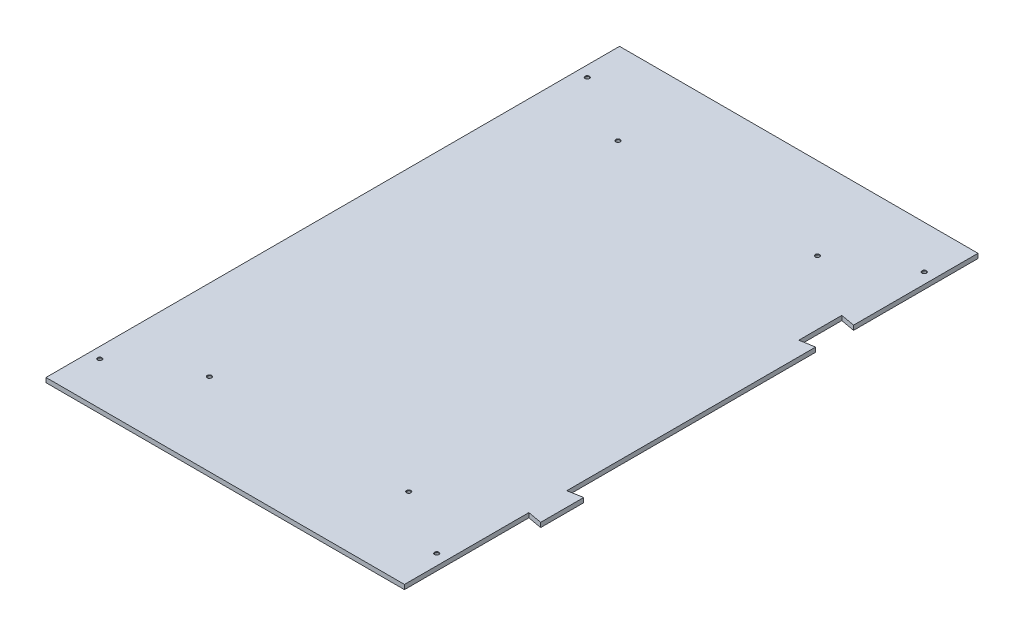
ISO-10303-21;
HEADER;
FILE_DESCRIPTION(('STEP AP214'),'2;1');
FILE_NAME('part.step','',(''),(''),'','','');
FILE_SCHEMA(('AUTOMOTIVE_DESIGN { 1 0 10303 214 1 1 1 1 }'));
ENDSEC;
DATA;
#1=APPLICATION_CONTEXT('core data for automotive mechanical design processes');
#2=APPLICATION_PROTOCOL_DEFINITION('international standard','automotive_design',2000,#1);
#3=PRODUCT_CONTEXT('',#1,'mechanical');
#4=PRODUCT('Part','Part','',(#3));
#5=PRODUCT_RELATED_PRODUCT_CATEGORY('part','',(#4));
#6=PRODUCT_DEFINITION_FORMATION('','',#4);
#7=PRODUCT_DEFINITION_CONTEXT('part definition',#1,'design');
#8=PRODUCT_DEFINITION('design','',#6,#7);
#9=PRODUCT_DEFINITION_SHAPE('','',#8);
#10=(LENGTH_UNIT() NAMED_UNIT(*) SI_UNIT(.MILLI.,.METRE.));
#11=(NAMED_UNIT(*) PLANE_ANGLE_UNIT() SI_UNIT($,.RADIAN.));
#12=(NAMED_UNIT(*) SI_UNIT($,.STERADIAN.) SOLID_ANGLE_UNIT());
#13=UNCERTAINTY_MEASURE_WITH_UNIT(LENGTH_MEASURE(1.E-05),#10,'distance_accuracy_value','');
#14=(GEOMETRIC_REPRESENTATION_CONTEXT(3) GLOBAL_UNCERTAINTY_ASSIGNED_CONTEXT((#13)) GLOBAL_UNIT_ASSIGNED_CONTEXT((#10,
#11,#12)) REPRESENTATION_CONTEXT('',''));
#15=CARTESIAN_POINT('',(0.,0.,0.));
#16=DIRECTION('',(0.,0.,1.));
#17=DIRECTION('',(1.,0.,0.));
#18=AXIS2_PLACEMENT_3D('',#15,#16,#17);
#19=CARTESIAN_POINT('',(0.,3.175,86.7632698070847));
#20=DIRECTION('',(-1.,0.,0.));
#21=DIRECTION('',(0.,0.,1.));
#22=AXIS2_PLACEMENT_3D('',#19,#20,#21);
#23=PLANE('',#22);
#24=DIRECTION('',(0.,0.,-1.));
#25=VECTOR('',#24,1.);
#26=CARTESIAN_POINT('',(0.,0.,86.7632698070847));
#27=LINE('',#26,#25);
#28=CARTESIAN_POINT('',(0.,0.,86.7632698070847));
#29=VERTEX_POINT('',#28);
#30=CARTESIAN_POINT('',(0.,0.,-86.7632698070847));
#31=VERTEX_POINT('',#30);
#32=EDGE_CURVE('E153',#29,#31,#27,.T.);
#33=ORIENTED_EDGE('',*,*,#32,.T.);
#34=DIRECTION('',(0.,-1.,0.));
#35=VECTOR('',#34,1.);
#36=CARTESIAN_POINT('',(0.,3.175,-86.7632698070847));
#37=LINE('',#36,#35);
#38=CARTESIAN_POINT('',(0.,3.175,-86.7632698070847));
#39=VERTEX_POINT('',#38);
#40=EDGE_CURVE('E11',#39,#31,#37,.T.);
#41=ORIENTED_EDGE('',*,*,#40,.F.);
#42=DIRECTION('',(0.,0.,-1.));
#43=VECTOR('',#42,1.);
#44=CARTESIAN_POINT('',(0.,3.175,86.7632698070847));
#45=LINE('',#44,#43);
#46=CARTESIAN_POINT('',(0.,3.175,86.7632698070847));
#47=VERTEX_POINT('',#46);
#48=EDGE_CURVE('E176',#47,#39,#45,.T.);
#49=ORIENTED_EDGE('',*,*,#48,.F.);
#50=DIRECTION('',(0.,-1.,0.));
#51=VECTOR('',#50,1.);
#52=CARTESIAN_POINT('',(0.,3.175,86.7632698070847));
#53=LINE('',#52,#51);
#54=EDGE_CURVE('E149',#47,#29,#53,.T.);
#55=ORIENTED_EDGE('',*,*,#54,.T.);
#56=EDGE_LOOP('',(#33,#41,#49,#55));
#57=FACE_BOUND('',#56,.T.);
#58=ADVANCED_FACE('F33',(#57),#23,.F.);
#59=CARTESIAN_POINT('',(0.,3.175,-86.7632698070847));
#60=DIRECTION('',(0.173648177666935,0.,0.984807753012207));
#61=DIRECTION('',(0.984807753012207,0.,-0.173648177666935));
#62=AXIS2_PLACEMENT_3D('',#59,#60,#61);
#63=PLANE('',#62);
#64=DIRECTION('',(-0.984807753012207,0.,0.173648177666935));
#65=VECTOR('',#64,1.);
#66=CARTESIAN_POINT('',(0.,0.,-86.7632698070847));
#67=LINE('',#66,#65);
#68=CARTESIAN_POINT('',(-10.,0.,-85.));
#69=VERTEX_POINT('',#68);
#70=EDGE_CURVE('E156',#31,#69,#67,.T.);
#71=ORIENTED_EDGE('',*,*,#70,.T.);
#72=DIRECTION('',(0.,-1.,0.));
#73=VECTOR('',#72,1.);
#74=CARTESIAN_POINT('',(-10.,3.175,-85.));
#75=LINE('',#74,#73);
#76=CARTESIAN_POINT('',(-10.,3.175,-85.));
#77=VERTEX_POINT('',#76);
#78=EDGE_CURVE('E41',#77,#69,#75,.T.);
#79=ORIENTED_EDGE('',*,*,#78,.F.);
#80=DIRECTION('',(-0.984807753012207,0.,0.173648177666935));
#81=VECTOR('',#80,1.);
#82=CARTESIAN_POINT('',(0.,3.175,-86.7632698070847));
#83=LINE('',#82,#81);
#84=EDGE_CURVE('E104',#39,#77,#83,.T.);
#85=ORIENTED_EDGE('',*,*,#84,.F.);
#86=ORIENTED_EDGE('',*,*,#40,.T.);
#87=EDGE_LOOP('',(#71,#79,#85,#86));
#88=FACE_BOUND('',#87,.T.);
#89=ADVANCED_FACE('F255',(#88),#63,.F.);
#90=CARTESIAN_POINT('',(-10.,3.175,-85.));
#91=DIRECTION('',(-1.,0.,0.));
#92=DIRECTION('',(0.,0.,1.));
#93=AXIS2_PLACEMENT_3D('',#90,#91,#92);
#94=PLANE('',#93);
#95=DIRECTION('',(0.,0.,-1.));
#96=VECTOR('',#95,1.);
#97=CARTESIAN_POINT('',(-10.,0.,-85.));
#98=LINE('',#97,#96);
#99=CARTESIAN_POINT('',(-10.,0.,-115.));
#100=VERTEX_POINT('',#99);
#101=EDGE_CURVE('E159',#69,#100,#98,.T.);
#102=ORIENTED_EDGE('',*,*,#101,.T.);
#103=DIRECTION('',(0.,-1.,0.));
#104=VECTOR('',#103,1.);
#105=CARTESIAN_POINT('',(-10.,3.175,-115.));
#106=LINE('',#105,#104);
#107=CARTESIAN_POINT('',(-10.,3.175,-115.));
#108=VERTEX_POINT('',#107);
#109=EDGE_CURVE('E195',#108,#100,#106,.T.);
#110=ORIENTED_EDGE('',*,*,#109,.F.);
#111=DIRECTION('',(0.,0.,-1.));
#112=VECTOR('',#111,1.);
#113=CARTESIAN_POINT('',(-10.,3.175,-85.));
#114=LINE('',#113,#112);
#115=EDGE_CURVE('E203',#77,#108,#114,.T.);
#116=ORIENTED_EDGE('',*,*,#115,.F.);
#117=ORIENTED_EDGE('',*,*,#78,.T.);
#118=EDGE_LOOP('',(#102,#110,#116,#117));
#119=FACE_BOUND('',#118,.T.);
#120=ADVANCED_FACE('F201',(#119),#94,.F.);
#121=CARTESIAN_POINT('',(-10.,3.175,-115.));
#122=DIRECTION('',(0.173648177666934,0.,-0.984807753012207));
#123=DIRECTION('',(-0.984807753012208,0.,-0.173648177666934));
#124=AXIS2_PLACEMENT_3D('',#121,#122,#123);
#125=PLANE('',#124);
#126=DIRECTION('',(0.984807753012207,0.,0.173648177666934));
#127=VECTOR('',#126,1.);
#128=CARTESIAN_POINT('',(-10.,0.,-115.));
#129=LINE('',#128,#127);
#130=CARTESIAN_POINT('',(0.,0.,-113.236730192915));
#131=VERTEX_POINT('',#130);
#132=EDGE_CURVE('E161',#100,#131,#129,.T.);
#133=ORIENTED_EDGE('',*,*,#132,.T.);
#134=DIRECTION('',(0.,-1.,0.));
#135=VECTOR('',#134,1.);
#136=CARTESIAN_POINT('',(0.,3.175,-113.236730192915));
#137=LINE('',#136,#135);
#138=CARTESIAN_POINT('',(0.,3.175,-113.236730192915));
#139=VERTEX_POINT('',#138);
#140=EDGE_CURVE('E192',#139,#131,#137,.T.);
#141=ORIENTED_EDGE('',*,*,#140,.F.);
#142=DIRECTION('',(0.984807753012207,0.,0.173648177666934));
#143=VECTOR('',#142,1.);
#144=CARTESIAN_POINT('',(-10.,3.175,-115.));
#145=LINE('',#144,#143);
#146=EDGE_CURVE('E221',#108,#139,#145,.T.);
#147=ORIENTED_EDGE('',*,*,#146,.F.);
#148=ORIENTED_EDGE('',*,*,#109,.T.);
#149=EDGE_LOOP('',(#133,#141,#147,#148));
#150=FACE_BOUND('',#149,.T.);
#151=ADVANCED_FACE('F212',(#150),#125,.F.);
#152=CARTESIAN_POINT('',(0.,3.175,-113.236730192915));
#153=DIRECTION('',(-1.,0.,0.));
#154=DIRECTION('',(0.,0.,1.));
#155=AXIS2_PLACEMENT_3D('',#152,#153,#154);
#156=PLANE('',#155);
#157=DIRECTION('',(0.,0.,-1.));
#158=VECTOR('',#157,1.);
#159=CARTESIAN_POINT('',(0.,0.,-113.236730192915));
#160=LINE('',#159,#158);
#161=CARTESIAN_POINT('',(0.,0.,-200.));
#162=VERTEX_POINT('',#161);
#163=EDGE_CURVE('E163',#131,#162,#160,.T.);
#164=ORIENTED_EDGE('',*,*,#163,.T.);
#165=DIRECTION('',(0.,-1.,0.));
#166=VECTOR('',#165,1.);
#167=CARTESIAN_POINT('',(0.,3.175,-200.));
#168=LINE('',#167,#166);
#169=CARTESIAN_POINT('',(0.,3.175,-200.));
#170=VERTEX_POINT('',#169);
#171=EDGE_CURVE('E189',#170,#162,#168,.T.);
#172=ORIENTED_EDGE('',*,*,#171,.F.);
#173=DIRECTION('',(0.,0.,-1.));
#174=VECTOR('',#173,1.);
#175=CARTESIAN_POINT('',(0.,3.175,-113.236730192915));
#176=LINE('',#175,#174);
#177=EDGE_CURVE('E218',#139,#170,#176,.T.);
#178=ORIENTED_EDGE('',*,*,#177,.F.);
#179=ORIENTED_EDGE('',*,*,#140,.T.);
#180=EDGE_LOOP('',(#164,#172,#178,#179));
#181=FACE_BOUND('',#180,.T.);
#182=ADVANCED_FACE('F216',(#181),#156,.F.);
#183=CARTESIAN_POINT('',(0.,3.175,-200.));
#184=DIRECTION('',(0.,0.,1.));
#185=DIRECTION('',(1.,0.,0.));
#186=AXIS2_PLACEMENT_3D('',#183,#184,#185);
#187=PLANE('',#186);
#188=DIRECTION('',(-1.,0.,0.));
#189=VECTOR('',#188,1.);
#190=CARTESIAN_POINT('',(0.,0.,-200.));
#191=LINE('',#190,#189);
#192=CARTESIAN_POINT('',(-250.,0.,-200.));
#193=VERTEX_POINT('',#192);
#194=EDGE_CURVE('E165',#162,#193,#191,.T.);
#195=ORIENTED_EDGE('',*,*,#194,.T.);
#196=DIRECTION('',(0.,-1.,0.));
#197=VECTOR('',#196,1.);
#198=CARTESIAN_POINT('',(-250.,3.175,-200.));
#199=LINE('',#198,#197);
#200=CARTESIAN_POINT('',(-250.,3.175,-200.));
#201=VERTEX_POINT('',#200);
#202=EDGE_CURVE('E186',#201,#193,#199,.T.);
#203=ORIENTED_EDGE('',*,*,#202,.F.);
#204=DIRECTION('',(-1.,0.,0.));
#205=VECTOR('',#204,1.);
#206=CARTESIAN_POINT('',(0.,3.175,-200.));
#207=LINE('',#206,#205);
#208=EDGE_CURVE('E220',#170,#201,#207,.T.);
#209=ORIENTED_EDGE('',*,*,#208,.F.);
#210=ORIENTED_EDGE('',*,*,#171,.T.);
#211=EDGE_LOOP('',(#195,#203,#209,#210));
#212=FACE_BOUND('',#211,.T.);
#213=ADVANCED_FACE('F268',(#212),#187,.F.);
#214=CARTESIAN_POINT('',(-250.,3.175,-200.));
#215=DIRECTION('',(1.,0.,0.));
#216=DIRECTION('',(0.,0.,-1.));
#217=AXIS2_PLACEMENT_3D('',#214,#215,#216);
#218=PLANE('',#217);
#219=DIRECTION('',(0.,0.,1.));
#220=VECTOR('',#219,1.);
#221=CARTESIAN_POINT('',(-250.,0.,-200.));
#222=LINE('',#221,#220);
#223=CARTESIAN_POINT('',(-250.,0.,200.));
#224=VERTEX_POINT('',#223);
#225=EDGE_CURVE('E167',#193,#224,#222,.T.);
#226=ORIENTED_EDGE('',*,*,#225,.T.);
#227=DIRECTION('',(0.,-1.,0.));
#228=VECTOR('',#227,1.);
#229=CARTESIAN_POINT('',(-250.,3.175,200.));
#230=LINE('',#229,#228);
#231=CARTESIAN_POINT('',(-250.,3.175,200.));
#232=VERTEX_POINT('',#231);
#233=EDGE_CURVE('E183',#232,#224,#230,.T.);
#234=ORIENTED_EDGE('',*,*,#233,.F.);
#235=DIRECTION('',(0.,0.,1.));
#236=VECTOR('',#235,1.);
#237=CARTESIAN_POINT('',(-250.,3.175,-200.));
#238=LINE('',#237,#236);
#239=EDGE_CURVE('E223',#201,#232,#238,.T.);
#240=ORIENTED_EDGE('',*,*,#239,.F.);
#241=ORIENTED_EDGE('',*,*,#202,.T.);
#242=EDGE_LOOP('',(#226,#234,#240,#241));
#243=FACE_BOUND('',#242,.T.);
#244=ADVANCED_FACE('F271',(#243),#218,.F.);
#245=CARTESIAN_POINT('',(0.,3.175,200.));
#246=DIRECTION('',(0.,0.,-1.));
#247=DIRECTION('',(-1.,0.,0.));
#248=AXIS2_PLACEMENT_3D('',#245,#246,#247);
#249=PLANE('',#248);
#250=DIRECTION('',(1.,0.,0.));
#251=VECTOR('',#250,1.);
#252=CARTESIAN_POINT('',(0.,0.,200.));
#253=LINE('',#252,#251);
#254=CARTESIAN_POINT('',(0.,0.,200.));
#255=VERTEX_POINT('',#254);
#256=EDGE_CURVE('E169',#224,#255,#253,.T.);
#257=ORIENTED_EDGE('',*,*,#256,.T.);
#258=DIRECTION('',(0.,-1.,0.));
#259=VECTOR('',#258,1.);
#260=CARTESIAN_POINT('',(0.,3.175,200.));
#261=LINE('',#260,#259);
#262=CARTESIAN_POINT('',(0.,3.175,200.));
#263=VERTEX_POINT('',#262);
#264=EDGE_CURVE('E180',#263,#255,#261,.T.);
#265=ORIENTED_EDGE('',*,*,#264,.F.);
#266=DIRECTION('',(1.,0.,0.));
#267=VECTOR('',#266,1.);
#268=CARTESIAN_POINT('',(0.,3.175,200.));
#269=LINE('',#268,#267);
#270=EDGE_CURVE('E229',#232,#263,#269,.T.);
#271=ORIENTED_EDGE('',*,*,#270,.F.);
#272=ORIENTED_EDGE('',*,*,#233,.T.);
#273=EDGE_LOOP('',(#257,#265,#271,#272));
#274=FACE_BOUND('',#273,.T.);
#275=ADVANCED_FACE('F235',(#274),#249,.F.);
#276=CARTESIAN_POINT('',(0.,3.175,113.236730192915));
#277=DIRECTION('',(-1.,0.,0.));
#278=DIRECTION('',(0.,0.,1.));
#279=AXIS2_PLACEMENT_3D('',#276,#277,#278);
#280=PLANE('',#279);
#281=DIRECTION('',(0.,0.,-1.));
#282=VECTOR('',#281,1.);
#283=CARTESIAN_POINT('',(0.,0.,113.236730192915));
#284=LINE('',#283,#282);
#285=CARTESIAN_POINT('',(0.,0.,113.236730192915));
#286=VERTEX_POINT('',#285);
#287=EDGE_CURVE('E171',#255,#286,#284,.T.);
#288=ORIENTED_EDGE('',*,*,#287,.T.);
#289=DIRECTION('',(0.,-1.,0.));
#290=VECTOR('',#289,1.);
#291=CARTESIAN_POINT('',(0.,3.175,113.236730192915));
#292=LINE('',#291,#290);
#293=CARTESIAN_POINT('',(0.,3.175,113.236730192915));
#294=VERTEX_POINT('',#293);
#295=EDGE_CURVE('E144',#294,#286,#292,.T.);
#296=ORIENTED_EDGE('',*,*,#295,.F.);
#297=DIRECTION('',(0.,0.,-1.));
#298=VECTOR('',#297,1.);
#299=CARTESIAN_POINT('',(0.,3.175,113.236730192915));
#300=LINE('',#299,#298);
#301=EDGE_CURVE('E135',#263,#294,#300,.T.);
#302=ORIENTED_EDGE('',*,*,#301,.F.);
#303=ORIENTED_EDGE('',*,*,#264,.T.);
#304=EDGE_LOOP('',(#288,#296,#302,#303));
#305=FACE_BOUND('',#304,.T.);
#306=ADVANCED_FACE('F239',(#305),#280,.F.);
#307=CARTESIAN_POINT('',(10.,3.175,115.));
#308=DIRECTION('',(0.173648177666933,0.,-0.984807753012208));
#309=DIRECTION('',(-0.984807753012208,0.,-0.173648177666933));
#310=AXIS2_PLACEMENT_3D('',#307,#308,#309);
#311=PLANE('',#310);
#312=DIRECTION('',(0.984807753012208,0.,0.173648177666933));
#313=VECTOR('',#312,1.);
#314=CARTESIAN_POINT('',(10.,0.,115.));
#315=LINE('',#314,#313);
#316=CARTESIAN_POINT('',(10.,0.,115.));
#317=VERTEX_POINT('',#316);
#318=EDGE_CURVE('E143',#286,#317,#315,.T.);
#319=ORIENTED_EDGE('',*,*,#318,.T.);
#320=DIRECTION('',(0.,-1.,0.));
#321=VECTOR('',#320,1.);
#322=CARTESIAN_POINT('',(10.,3.175,115.));
#323=LINE('',#322,#321);
#324=CARTESIAN_POINT('',(10.,3.175,115.));
#325=VERTEX_POINT('',#324);
#326=EDGE_CURVE('E140',#325,#317,#323,.T.);
#327=ORIENTED_EDGE('',*,*,#326,.F.);
#328=DIRECTION('',(0.984807753012208,0.,0.173648177666933));
#329=VECTOR('',#328,1.);
#330=CARTESIAN_POINT('',(10.,3.175,115.));
#331=LINE('',#330,#329);
#332=EDGE_CURVE('E129',#294,#325,#331,.T.);
#333=ORIENTED_EDGE('',*,*,#332,.F.);
#334=ORIENTED_EDGE('',*,*,#295,.T.);
#335=EDGE_LOOP('',(#319,#327,#333,#334));
#336=FACE_BOUND('',#335,.T.);
#337=ADVANCED_FACE('F141',(#336),#311,.F.);
#338=CARTESIAN_POINT('',(10.,3.175,85.));
#339=DIRECTION('',(-1.,0.,0.));
#340=DIRECTION('',(0.,0.,1.));
#341=AXIS2_PLACEMENT_3D('',#338,#339,#340);
#342=PLANE('',#341);
#343=DIRECTION('',(0.,0.,-1.));
#344=VECTOR('',#343,1.);
#345=CARTESIAN_POINT('',(10.,0.,85.));
#346=LINE('',#345,#344);
#347=CARTESIAN_POINT('',(10.,0.,85.));
#348=VERTEX_POINT('',#347);
#349=EDGE_CURVE('E90',#317,#348,#346,.T.);
#350=ORIENTED_EDGE('',*,*,#349,.T.);
#351=DIRECTION('',(0.,-1.,0.));
#352=VECTOR('',#351,1.);
#353=CARTESIAN_POINT('',(10.,3.175,85.));
#354=LINE('',#353,#352);
#355=CARTESIAN_POINT('',(10.,3.175,85.));
#356=VERTEX_POINT('',#355);
#357=EDGE_CURVE('E145',#356,#348,#354,.T.);
#358=ORIENTED_EDGE('',*,*,#357,.F.);
#359=DIRECTION('',(0.,0.,-1.));
#360=VECTOR('',#359,1.);
#361=CARTESIAN_POINT('',(10.,3.175,85.));
#362=LINE('',#361,#360);
#363=EDGE_CURVE('E133',#325,#356,#362,.T.);
#364=ORIENTED_EDGE('',*,*,#363,.F.);
#365=ORIENTED_EDGE('',*,*,#326,.T.);
#366=EDGE_LOOP('',(#350,#358,#364,#365));
#367=FACE_BOUND('',#366,.T.);
#368=ADVANCED_FACE('F147',(#367),#342,.F.);
#369=CARTESIAN_POINT('',(0.,3.175,86.7632698070847));
#370=DIRECTION('',(0.173648177666935,0.,0.984807753012207));
#371=DIRECTION('',(0.984807753012207,0.,-0.173648177666935));
#372=AXIS2_PLACEMENT_3D('',#369,#370,#371);
#373=PLANE('',#372);
#374=DIRECTION('',(-0.984807753012207,0.,0.173648177666935));
#375=VECTOR('',#374,1.);
#376=CARTESIAN_POINT('',(0.,0.,86.7632698070847));
#377=LINE('',#376,#375);
#378=EDGE_CURVE('E96',#348,#29,#377,.T.);
#379=ORIENTED_EDGE('',*,*,#378,.T.);
#380=ORIENTED_EDGE('',*,*,#54,.F.);
#381=DIRECTION('',(-0.984807753012207,0.,0.173648177666935));
#382=VECTOR('',#381,1.);
#383=CARTESIAN_POINT('',(0.,3.175,86.7632698070847));
#384=LINE('',#383,#382);
#385=EDGE_CURVE('E49',#356,#47,#384,.T.);
#386=ORIENTED_EDGE('',*,*,#385,.F.);
#387=ORIENTED_EDGE('',*,*,#357,.T.);
#388=EDGE_LOOP('',(#379,#380,#386,#387));
#389=FACE_BOUND('',#388,.T.);
#390=ADVANCED_FACE('F243',(#389),#373,.F.);
#391=CARTESIAN_POINT('',(0.,3.175,0.));
#392=DIRECTION('',(0.,1.,0.));
#393=DIRECTION('',(0.,0.,1.));
#394=AXIS2_PLACEMENT_3D('',#391,#392,#393);
#395=PLANE('',#394);
#396=CARTESIAN_POINT('',(-193.539921074406,3.175,-142.5));
#397=DIRECTION('',(0.,1.,0.));
#398=DIRECTION('',(0.,0.,1.));
#399=AXIS2_PLACEMENT_3D('',#396,#397,#398);
#400=CIRCLE('',#399,1.525);
#401=CARTESIAN_POINT('',(-193.539921074406,3.175,-140.975));
#402=VERTEX_POINT('',#401);
#403=EDGE_CURVE('E477',#402,#402,#400,.T.);
#404=ORIENTED_EDGE('',*,*,#403,.F.);
#405=EDGE_LOOP('',(#404));
#406=FACE_BOUND('',#405,.T.);
#407=CARTESIAN_POINT('',(-193.539921074405,3.175,142.5));
#408=DIRECTION('',(0.,1.,0.));
#409=DIRECTION('',(0.,0.,1.));
#410=AXIS2_PLACEMENT_3D('',#407,#408,#409);
#411=CIRCLE('',#410,1.525);
#412=CARTESIAN_POINT('',(-193.539921074405,3.175,144.025));
#413=VERTEX_POINT('',#412);
#414=EDGE_CURVE('E484',#413,#413,#411,.T.);
#415=ORIENTED_EDGE('',*,*,#414,.F.);
#416=EDGE_LOOP('',(#415));
#417=FACE_BOUND('',#416,.T.);
#418=CARTESIAN_POINT('',(-54.5164953047991,3.175,-142.5));
#419=DIRECTION('',(0.,1.,0.));
#420=DIRECTION('',(0.,0.,1.));
#421=AXIS2_PLACEMENT_3D('',#418,#419,#420);
#422=CIRCLE('',#421,1.525);
#423=CARTESIAN_POINT('',(-54.5164953047991,3.175,-140.975));
#424=VERTEX_POINT('',#423);
#425=EDGE_CURVE('E493',#424,#424,#422,.T.);
#426=ORIENTED_EDGE('',*,*,#425,.F.);
#427=EDGE_LOOP('',(#426));
#428=FACE_BOUND('',#427,.T.);
#429=CARTESIAN_POINT('',(-54.5164953047991,3.175,142.5));
#430=DIRECTION('',(0.,1.,0.));
#431=DIRECTION('',(0.,0.,1.));
#432=AXIS2_PLACEMENT_3D('',#429,#430,#431);
#433=CIRCLE('',#432,1.525);
#434=CARTESIAN_POINT('',(-54.5164953047991,3.175,144.025));
#435=VERTEX_POINT('',#434);
#436=EDGE_CURVE('E502',#435,#435,#433,.T.);
#437=ORIENTED_EDGE('',*,*,#436,.F.);
#438=EDGE_LOOP('',(#437));
#439=FACE_BOUND('',#438,.T.);
#440=CARTESIAN_POINT('',(-242.5,3.175,170.));
#441=DIRECTION('',(0.,1.,0.));
#442=DIRECTION('',(0.,0.,1.));
#443=AXIS2_PLACEMENT_3D('',#440,#441,#442);
#444=CIRCLE('',#443,1.525);
#445=CARTESIAN_POINT('',(-242.5,3.175,171.525));
#446=VERTEX_POINT('',#445);
#447=EDGE_CURVE('E511',#446,#446,#444,.T.);
#448=ORIENTED_EDGE('',*,*,#447,.F.);
#449=EDGE_LOOP('',(#448));
#450=FACE_BOUND('',#449,.T.);
#451=CARTESIAN_POINT('',(-242.5,3.175,-170.));
#452=DIRECTION('',(0.,1.,0.));
#453=DIRECTION('',(0.,0.,1.));
#454=AXIS2_PLACEMENT_3D('',#451,#452,#453);
#455=CIRCLE('',#454,1.525);
#456=CARTESIAN_POINT('',(-242.5,3.175,-168.475));
#457=VERTEX_POINT('',#456);
#458=EDGE_CURVE('E520',#457,#457,#455,.T.);
#459=ORIENTED_EDGE('',*,*,#458,.F.);
#460=EDGE_LOOP('',(#459));
#461=FACE_BOUND('',#460,.T.);
#462=CARTESIAN_POINT('',(-7.49999999999999,3.175,170.));
#463=DIRECTION('',(0.,1.,0.));
#464=DIRECTION('',(0.,0.,1.));
#465=AXIS2_PLACEMENT_3D('',#462,#463,#464);
#466=CIRCLE('',#465,1.525);
#467=CARTESIAN_POINT('',(-7.49999999999999,3.175,171.525));
#468=VERTEX_POINT('',#467);
#469=EDGE_CURVE('E529',#468,#468,#466,.T.);
#470=ORIENTED_EDGE('',*,*,#469,.F.);
#471=EDGE_LOOP('',(#470));
#472=FACE_BOUND('',#471,.T.);
#473=CARTESIAN_POINT('',(-7.50000000000016,3.175,-170.));
#474=DIRECTION('',(0.,1.,0.));
#475=DIRECTION('',(0.,0.,1.));
#476=AXIS2_PLACEMENT_3D('',#473,#474,#475);
#477=CIRCLE('',#476,1.525);
#478=CARTESIAN_POINT('',(-7.50000000000016,3.175,-168.475));
#479=VERTEX_POINT('',#478);
#480=EDGE_CURVE('E538',#479,#479,#477,.T.);
#481=ORIENTED_EDGE('',*,*,#480,.F.);
#482=EDGE_LOOP('',(#481));
#483=FACE_BOUND('',#482,.T.);
#484=ORIENTED_EDGE('',*,*,#48,.T.);
#485=ORIENTED_EDGE('',*,*,#84,.T.);
#486=ORIENTED_EDGE('',*,*,#115,.T.);
#487=ORIENTED_EDGE('',*,*,#146,.T.);
#488=ORIENTED_EDGE('',*,*,#177,.T.);
#489=ORIENTED_EDGE('',*,*,#208,.T.);
#490=ORIENTED_EDGE('',*,*,#239,.T.);
#491=ORIENTED_EDGE('',*,*,#270,.T.);
#492=ORIENTED_EDGE('',*,*,#301,.T.);
#493=ORIENTED_EDGE('',*,*,#332,.T.);
#494=ORIENTED_EDGE('',*,*,#363,.T.);
#495=ORIENTED_EDGE('',*,*,#385,.T.);
#496=EDGE_LOOP('',(#484,#485,#486,#487,#488,#489,#490,#491,#492,#493,#494,#495));
#497=FACE_BOUND('',#496,.T.);
#498=ADVANCED_FACE('F131',(#406,#417,#428,#439,#450,#461,#472,#483,#497),#395,.T.);
#499=CARTESIAN_POINT('',(0.,0.,0.));
#500=DIRECTION('',(0.,1.,0.));
#501=DIRECTION('',(0.,0.,1.));
#502=AXIS2_PLACEMENT_3D('',#499,#500,#501);
#503=PLANE('',#502);
#504=CARTESIAN_POINT('',(-193.539921074406,0.,-142.5));
#505=DIRECTION('',(0.,1.,0.));
#506=DIRECTION('',(0.,0.,1.));
#507=AXIS2_PLACEMENT_3D('',#504,#505,#506);
#508=CIRCLE('',#507,1.25);
#509=CARTESIAN_POINT('',(-193.539921074406,0.,-141.25));
#510=VERTEX_POINT('',#509);
#511=EDGE_CURVE('E479',#510,#510,#508,.T.);
#512=ORIENTED_EDGE('',*,*,#511,.T.);
#513=EDGE_LOOP('',(#512));
#514=FACE_BOUND('',#513,.T.);
#515=CARTESIAN_POINT('',(-193.539921074405,0.,142.5));
#516=DIRECTION('',(0.,1.,0.));
#517=DIRECTION('',(0.,0.,1.));
#518=AXIS2_PLACEMENT_3D('',#515,#516,#517);
#519=CIRCLE('',#518,1.25);
#520=CARTESIAN_POINT('',(-193.539921074405,0.,143.75));
#521=VERTEX_POINT('',#520);
#522=EDGE_CURVE('E490',#521,#521,#519,.T.);
#523=ORIENTED_EDGE('',*,*,#522,.T.);
#524=EDGE_LOOP('',(#523));
#525=FACE_BOUND('',#524,.T.);
#526=CARTESIAN_POINT('',(-54.5164953047991,0.,-142.5));
#527=DIRECTION('',(0.,1.,0.));
#528=DIRECTION('',(0.,0.,1.));
#529=AXIS2_PLACEMENT_3D('',#526,#527,#528);
#530=CIRCLE('',#529,1.25);
#531=CARTESIAN_POINT('',(-54.5164953047991,0.,-141.25));
#532=VERTEX_POINT('',#531);
#533=EDGE_CURVE('E499',#532,#532,#530,.T.);
#534=ORIENTED_EDGE('',*,*,#533,.T.);
#535=EDGE_LOOP('',(#534));
#536=FACE_BOUND('',#535,.T.);
#537=CARTESIAN_POINT('',(-54.5164953047991,0.,142.5));
#538=DIRECTION('',(0.,1.,0.));
#539=DIRECTION('',(0.,0.,1.));
#540=AXIS2_PLACEMENT_3D('',#537,#538,#539);
#541=CIRCLE('',#540,1.25);
#542=CARTESIAN_POINT('',(-54.5164953047991,0.,143.75));
#543=VERTEX_POINT('',#542);
#544=EDGE_CURVE('E508',#543,#543,#541,.T.);
#545=ORIENTED_EDGE('',*,*,#544,.T.);
#546=EDGE_LOOP('',(#545));
#547=FACE_BOUND('',#546,.T.);
#548=CARTESIAN_POINT('',(-242.5,0.,170.));
#549=DIRECTION('',(0.,1.,0.));
#550=DIRECTION('',(0.,0.,1.));
#551=AXIS2_PLACEMENT_3D('',#548,#549,#550);
#552=CIRCLE('',#551,1.25);
#553=CARTESIAN_POINT('',(-242.5,0.,171.25));
#554=VERTEX_POINT('',#553);
#555=EDGE_CURVE('E517',#554,#554,#552,.T.);
#556=ORIENTED_EDGE('',*,*,#555,.T.);
#557=EDGE_LOOP('',(#556));
#558=FACE_BOUND('',#557,.T.);
#559=CARTESIAN_POINT('',(-242.5,0.,-170.));
#560=DIRECTION('',(0.,1.,0.));
#561=DIRECTION('',(0.,0.,1.));
#562=AXIS2_PLACEMENT_3D('',#559,#560,#561);
#563=CIRCLE('',#562,1.25);
#564=CARTESIAN_POINT('',(-242.5,0.,-168.75));
#565=VERTEX_POINT('',#564);
#566=EDGE_CURVE('E526',#565,#565,#563,.T.);
#567=ORIENTED_EDGE('',*,*,#566,.T.);
#568=EDGE_LOOP('',(#567));
#569=FACE_BOUND('',#568,.T.);
#570=CARTESIAN_POINT('',(-7.49999999999999,0.,170.));
#571=DIRECTION('',(0.,1.,0.));
#572=DIRECTION('',(0.,0.,1.));
#573=AXIS2_PLACEMENT_3D('',#570,#571,#572);
#574=CIRCLE('',#573,1.25);
#575=CARTESIAN_POINT('',(-7.49999999999999,0.,171.25));
#576=VERTEX_POINT('',#575);
#577=EDGE_CURVE('E535',#576,#576,#574,.T.);
#578=ORIENTED_EDGE('',*,*,#577,.T.);
#579=EDGE_LOOP('',(#578));
#580=FACE_BOUND('',#579,.T.);
#581=CARTESIAN_POINT('',(-7.50000000000016,0.,-170.));
#582=DIRECTION('',(0.,1.,0.));
#583=DIRECTION('',(0.,0.,1.));
#584=AXIS2_PLACEMENT_3D('',#581,#582,#583);
#585=CIRCLE('',#584,1.25);
#586=CARTESIAN_POINT('',(-7.50000000000016,0.,-168.75));
#587=VERTEX_POINT('',#586);
#588=EDGE_CURVE('E157',#587,#587,#585,.T.);
#589=ORIENTED_EDGE('',*,*,#588,.T.);
#590=EDGE_LOOP('',(#589));
#591=FACE_BOUND('',#590,.T.);
#592=ORIENTED_EDGE('',*,*,#32,.F.);
#593=ORIENTED_EDGE('',*,*,#378,.F.);
#594=ORIENTED_EDGE('',*,*,#349,.F.);
#595=ORIENTED_EDGE('',*,*,#318,.F.);
#596=ORIENTED_EDGE('',*,*,#287,.F.);
#597=ORIENTED_EDGE('',*,*,#256,.F.);
#598=ORIENTED_EDGE('',*,*,#225,.F.);
#599=ORIENTED_EDGE('',*,*,#194,.F.);
#600=ORIENTED_EDGE('',*,*,#163,.F.);
#601=ORIENTED_EDGE('',*,*,#132,.F.);
#602=ORIENTED_EDGE('',*,*,#101,.F.);
#603=ORIENTED_EDGE('',*,*,#70,.F.);
#604=EDGE_LOOP('',(#592,#593,#594,#595,#596,#597,#598,#599,#600,#601,#602,#603));
#605=FACE_BOUND('',#604,.T.);
#606=ADVANCED_FACE('F207',(#514,#525,#536,#547,#558,#569,#580,#591,#605),#503,.F.);
#607=CARTESIAN_POINT('',(-7.50000000000016,3.175,-170.));
#608=DIRECTION('',(0.,1.,0.));
#609=DIRECTION('',(0.,0.,1.));
#610=AXIS2_PLACEMENT_3D('',#607,#608,#609);
#611=CYLINDRICAL_SURFACE('',#610,1.24999999999999);
#612=ORIENTED_EDGE('',*,*,#588,.F.);
#613=EDGE_LOOP('',(#612));
#614=FACE_BOUND('',#613,.T.);
#615=CARTESIAN_POINT('',(-7.50000000000016,2.89999999999999,-170.));
#616=DIRECTION('',(0.,1.,0.));
#617=DIRECTION('',(0.,0.,1.));
#618=AXIS2_PLACEMENT_3D('',#615,#616,#617);
#619=CIRCLE('',#618,1.24999999999999);
#620=CARTESIAN_POINT('',(-7.50000000000016,2.89999999999999,-168.75));
#621=VERTEX_POINT('',#620);
#622=EDGE_CURVE('E541',#621,#621,#619,.T.);
#623=ORIENTED_EDGE('',*,*,#622,.T.);
#624=EDGE_LOOP('',(#623));
#625=FACE_BOUND('',#624,.T.);
#626=ADVANCED_FACE('F308',(#614,#625),#611,.F.);
#627=CARTESIAN_POINT('',(-7.50000000000016,3.175,-170.));
#628=DIRECTION('',(0.,1.,0.));
#629=DIRECTION('',(0.,0.,1.));
#630=AXIS2_PLACEMENT_3D('',#627,#628,#629);
#631=CONICAL_SURFACE('',#630,1.525,0.785398163397448);
#632=ORIENTED_EDGE('',*,*,#622,.F.);
#633=EDGE_LOOP('',(#632));
#634=FACE_BOUND('',#633,.T.);
#635=ORIENTED_EDGE('',*,*,#480,.T.);
#636=EDGE_LOOP('',(#635));
#637=FACE_BOUND('',#636,.T.);
#638=ADVANCED_FACE('F317',(#634,#637),#631,.F.);
#639=CARTESIAN_POINT('',(-7.49999999999999,3.175,170.));
#640=DIRECTION('',(0.,1.,0.));
#641=DIRECTION('',(0.,0.,1.));
#642=AXIS2_PLACEMENT_3D('',#639,#640,#641);
#643=CYLINDRICAL_SURFACE('',#642,1.24999999999999);
#644=ORIENTED_EDGE('',*,*,#577,.F.);
#645=EDGE_LOOP('',(#644));
#646=FACE_BOUND('',#645,.T.);
#647=CARTESIAN_POINT('',(-7.49999999999999,2.89999999999999,170.));
#648=DIRECTION('',(0.,1.,0.));
#649=DIRECTION('',(0.,0.,1.));
#650=AXIS2_PLACEMENT_3D('',#647,#648,#649);
#651=CIRCLE('',#650,1.24999999999999);
#652=CARTESIAN_POINT('',(-7.49999999999999,2.89999999999999,171.25));
#653=VERTEX_POINT('',#652);
#654=EDGE_CURVE('E532',#653,#653,#651,.T.);
#655=ORIENTED_EDGE('',*,*,#654,.T.);
#656=EDGE_LOOP('',(#655));
#657=FACE_BOUND('',#656,.T.);
#658=ADVANCED_FACE('F327',(#646,#657),#643,.F.);
#659=CARTESIAN_POINT('',(-7.49999999999999,3.175,170.));
#660=DIRECTION('',(0.,1.,0.));
#661=DIRECTION('',(0.,0.,1.));
#662=AXIS2_PLACEMENT_3D('',#659,#660,#661);
#663=CONICAL_SURFACE('',#662,1.525,0.785398163397448);
#664=ORIENTED_EDGE('',*,*,#654,.F.);
#665=EDGE_LOOP('',(#664));
#666=FACE_BOUND('',#665,.T.);
#667=ORIENTED_EDGE('',*,*,#469,.T.);
#668=EDGE_LOOP('',(#667));
#669=FACE_BOUND('',#668,.T.);
#670=ADVANCED_FACE('F337',(#666,#669),#663,.F.);
#671=CARTESIAN_POINT('',(-242.5,3.175,-170.));
#672=DIRECTION('',(0.,1.,0.));
#673=DIRECTION('',(0.,0.,1.));
#674=AXIS2_PLACEMENT_3D('',#671,#672,#673);
#675=CYLINDRICAL_SURFACE('',#674,1.24999999999999);
#676=ORIENTED_EDGE('',*,*,#566,.F.);
#677=EDGE_LOOP('',(#676));
#678=FACE_BOUND('',#677,.T.);
#679=CARTESIAN_POINT('',(-242.5,2.89999999999999,-170.));
#680=DIRECTION('',(0.,1.,0.));
#681=DIRECTION('',(0.,0.,1.));
#682=AXIS2_PLACEMENT_3D('',#679,#680,#681);
#683=CIRCLE('',#682,1.24999999999997);
#684=CARTESIAN_POINT('',(-242.5,2.89999999999999,-168.75));
#685=VERTEX_POINT('',#684);
#686=EDGE_CURVE('E523',#685,#685,#683,.T.);
#687=ORIENTED_EDGE('',*,*,#686,.T.);
#688=EDGE_LOOP('',(#687));
#689=FACE_BOUND('',#688,.T.);
#690=ADVANCED_FACE('F347',(#678,#689),#675,.F.);
#691=CARTESIAN_POINT('',(-242.5,3.175,-170.));
#692=DIRECTION('',(0.,1.,0.));
#693=DIRECTION('',(0.,0.,1.));
#694=AXIS2_PLACEMENT_3D('',#691,#692,#693);
#695=CONICAL_SURFACE('',#694,1.525,0.78539816339747);
#696=ORIENTED_EDGE('',*,*,#686,.F.);
#697=EDGE_LOOP('',(#696));
#698=FACE_BOUND('',#697,.T.);
#699=ORIENTED_EDGE('',*,*,#458,.T.);
#700=EDGE_LOOP('',(#699));
#701=FACE_BOUND('',#700,.T.);
#702=ADVANCED_FACE('F357',(#698,#701),#695,.F.);
#703=CARTESIAN_POINT('',(-242.5,3.175,170.));
#704=DIRECTION('',(0.,1.,0.));
#705=DIRECTION('',(0.,0.,1.));
#706=AXIS2_PLACEMENT_3D('',#703,#704,#705);
#707=CYLINDRICAL_SURFACE('',#706,1.25);
#708=ORIENTED_EDGE('',*,*,#555,.F.);
#709=EDGE_LOOP('',(#708));
#710=FACE_BOUND('',#709,.T.);
#711=CARTESIAN_POINT('',(-242.5,2.89999999999999,170.));
#712=DIRECTION('',(0.,1.,0.));
#713=DIRECTION('',(0.,0.,1.));
#714=AXIS2_PLACEMENT_3D('',#711,#712,#713);
#715=CIRCLE('',#714,1.25);
#716=CARTESIAN_POINT('',(-242.5,2.89999999999999,171.25));
#717=VERTEX_POINT('',#716);
#718=EDGE_CURVE('E514',#717,#717,#715,.T.);
#719=ORIENTED_EDGE('',*,*,#718,.T.);
#720=EDGE_LOOP('',(#719));
#721=FACE_BOUND('',#720,.T.);
#722=ADVANCED_FACE('F367',(#710,#721),#707,.F.);
#723=CARTESIAN_POINT('',(-242.5,3.175,170.));
#724=DIRECTION('',(0.,1.,0.));
#725=DIRECTION('',(0.,0.,1.));
#726=AXIS2_PLACEMENT_3D('',#723,#724,#725);
#727=CONICAL_SURFACE('',#726,1.525,0.78539816339742);
#728=ORIENTED_EDGE('',*,*,#718,.F.);
#729=EDGE_LOOP('',(#728));
#730=FACE_BOUND('',#729,.T.);
#731=ORIENTED_EDGE('',*,*,#447,.T.);
#732=EDGE_LOOP('',(#731));
#733=FACE_BOUND('',#732,.T.);
#734=ADVANCED_FACE('F377',(#730,#733),#727,.F.);
#735=CARTESIAN_POINT('',(-54.5164953047991,3.175,142.5));
#736=DIRECTION('',(0.,1.,0.));
#737=DIRECTION('',(0.,0.,1.));
#738=AXIS2_PLACEMENT_3D('',#735,#736,#737);
#739=CYLINDRICAL_SURFACE('',#738,1.24999999999999);
#740=ORIENTED_EDGE('',*,*,#544,.F.);
#741=EDGE_LOOP('',(#740));
#742=FACE_BOUND('',#741,.T.);
#743=CARTESIAN_POINT('',(-54.5164953047991,2.89999999999999,142.5));
#744=DIRECTION('',(0.,1.,0.));
#745=DIRECTION('',(0.,0.,1.));
#746=AXIS2_PLACEMENT_3D('',#743,#744,#745);
#747=CIRCLE('',#746,1.24999999999999);
#748=CARTESIAN_POINT('',(-54.5164953047991,2.89999999999999,143.75));
#749=VERTEX_POINT('',#748);
#750=EDGE_CURVE('E505',#749,#749,#747,.T.);
#751=ORIENTED_EDGE('',*,*,#750,.T.);
#752=EDGE_LOOP('',(#751));
#753=FACE_BOUND('',#752,.T.);
#754=ADVANCED_FACE('F387',(#742,#753),#739,.F.);
#755=CARTESIAN_POINT('',(-54.5164953047991,3.175,142.5));
#756=DIRECTION('',(0.,1.,0.));
#757=DIRECTION('',(0.,0.,1.));
#758=AXIS2_PLACEMENT_3D('',#755,#756,#757);
#759=CONICAL_SURFACE('',#758,1.525,0.785398163397445);
#760=ORIENTED_EDGE('',*,*,#750,.F.);
#761=EDGE_LOOP('',(#760));
#762=FACE_BOUND('',#761,.T.);
#763=ORIENTED_EDGE('',*,*,#436,.T.);
#764=EDGE_LOOP('',(#763));
#765=FACE_BOUND('',#764,.T.);
#766=ADVANCED_FACE('F397',(#762,#765),#759,.F.);
#767=CARTESIAN_POINT('',(-54.5164953047991,3.175,-142.5));
#768=DIRECTION('',(0.,1.,0.));
#769=DIRECTION('',(0.,0.,1.));
#770=AXIS2_PLACEMENT_3D('',#767,#768,#769);
#771=CYLINDRICAL_SURFACE('',#770,1.24999999999999);
#772=ORIENTED_EDGE('',*,*,#533,.F.);
#773=EDGE_LOOP('',(#772));
#774=FACE_BOUND('',#773,.T.);
#775=CARTESIAN_POINT('',(-54.5164953047991,2.89999999999999,-142.5));
#776=DIRECTION('',(0.,1.,0.));
#777=DIRECTION('',(0.,0.,1.));
#778=AXIS2_PLACEMENT_3D('',#775,#776,#777);
#779=CIRCLE('',#778,1.24999999999999);
#780=CARTESIAN_POINT('',(-54.5164953047991,2.89999999999999,-141.25));
#781=VERTEX_POINT('',#780);
#782=EDGE_CURVE('E496',#781,#781,#779,.T.);
#783=ORIENTED_EDGE('',*,*,#782,.T.);
#784=EDGE_LOOP('',(#783));
#785=FACE_BOUND('',#784,.T.);
#786=ADVANCED_FACE('F407',(#774,#785),#771,.F.);
#787=CARTESIAN_POINT('',(-54.5164953047991,3.175,-142.5));
#788=DIRECTION('',(0.,1.,0.));
#789=DIRECTION('',(0.,0.,1.));
#790=AXIS2_PLACEMENT_3D('',#787,#788,#789);
#791=CONICAL_SURFACE('',#790,1.525,0.785398163397445);
#792=ORIENTED_EDGE('',*,*,#782,.F.);
#793=EDGE_LOOP('',(#792));
#794=FACE_BOUND('',#793,.T.);
#795=ORIENTED_EDGE('',*,*,#425,.T.);
#796=EDGE_LOOP('',(#795));
#797=FACE_BOUND('',#796,.T.);
#798=ADVANCED_FACE('F417',(#794,#797),#791,.F.);
#799=CARTESIAN_POINT('',(-193.539921074405,3.175,142.5));
#800=DIRECTION('',(0.,1.,0.));
#801=DIRECTION('',(0.,0.,1.));
#802=AXIS2_PLACEMENT_3D('',#799,#800,#801);
#803=CYLINDRICAL_SURFACE('',#802,1.25);
#804=ORIENTED_EDGE('',*,*,#522,.F.);
#805=EDGE_LOOP('',(#804));
#806=FACE_BOUND('',#805,.T.);
#807=CARTESIAN_POINT('',(-193.539921074405,2.89999999999999,142.5));
#808=DIRECTION('',(0.,1.,0.));
#809=DIRECTION('',(0.,0.,1.));
#810=AXIS2_PLACEMENT_3D('',#807,#808,#809);
#811=CIRCLE('',#810,1.25);
#812=CARTESIAN_POINT('',(-193.539921074405,2.89999999999999,143.75));
#813=VERTEX_POINT('',#812);
#814=EDGE_CURVE('E487',#813,#813,#811,.T.);
#815=ORIENTED_EDGE('',*,*,#814,.T.);
#816=EDGE_LOOP('',(#815));
#817=FACE_BOUND('',#816,.T.);
#818=ADVANCED_FACE('F427',(#806,#817),#803,.F.);
#819=CARTESIAN_POINT('',(-193.539921074405,3.175,142.5));
#820=DIRECTION('',(0.,1.,0.));
#821=DIRECTION('',(0.,0.,1.));
#822=AXIS2_PLACEMENT_3D('',#819,#820,#821);
#823=CONICAL_SURFACE('',#822,1.525,0.78539816339742);
#824=ORIENTED_EDGE('',*,*,#814,.F.);
#825=EDGE_LOOP('',(#824));
#826=FACE_BOUND('',#825,.T.);
#827=ORIENTED_EDGE('',*,*,#414,.T.);
#828=EDGE_LOOP('',(#827));
#829=FACE_BOUND('',#828,.T.);
#830=ADVANCED_FACE('F437',(#826,#829),#823,.F.);
#831=CARTESIAN_POINT('',(-193.539921074406,3.175,-142.5));
#832=DIRECTION('',(0.,1.,0.));
#833=DIRECTION('',(0.,0.,1.));
#834=AXIS2_PLACEMENT_3D('',#831,#832,#833);
#835=CYLINDRICAL_SURFACE('',#834,1.24999999999999);
#836=ORIENTED_EDGE('',*,*,#511,.F.);
#837=EDGE_LOOP('',(#836));
#838=FACE_BOUND('',#837,.T.);
#839=CARTESIAN_POINT('',(-193.539921074406,2.89999999999999,-142.5));
#840=DIRECTION('',(0.,1.,0.));
#841=DIRECTION('',(0.,0.,1.));
#842=AXIS2_PLACEMENT_3D('',#839,#840,#841);
#843=CIRCLE('',#842,1.24999999999997);
#844=CARTESIAN_POINT('',(-193.539921074406,2.89999999999999,-141.25));
#845=VERTEX_POINT('',#844);
#846=EDGE_CURVE('E474',#845,#845,#843,.T.);
#847=ORIENTED_EDGE('',*,*,#846,.T.);
#848=EDGE_LOOP('',(#847));
#849=FACE_BOUND('',#848,.T.);
#850=ADVANCED_FACE('F447',(#838,#849),#835,.F.);
#851=CARTESIAN_POINT('',(-193.539921074406,3.175,-142.5));
#852=DIRECTION('',(0.,1.,0.));
#853=DIRECTION('',(0.,0.,1.));
#854=AXIS2_PLACEMENT_3D('',#851,#852,#853);
#855=CONICAL_SURFACE('',#854,1.525,0.78539816339747);
#856=ORIENTED_EDGE('',*,*,#846,.F.);
#857=EDGE_LOOP('',(#856));
#858=FACE_BOUND('',#857,.T.);
#859=ORIENTED_EDGE('',*,*,#403,.T.);
#860=EDGE_LOOP('',(#859));
#861=FACE_BOUND('',#860,.T.);
#862=ADVANCED_FACE('F457',(#858,#861),#855,.F.);
#863=CLOSED_SHELL('',(#58,#89,#120,#151,#182,#213,#244,#275,#306,#337,#368,#390,#498,#606,#626,
#638,#658,#670,#690,#702,#722,#734,#754,#766,#786,#798,#818,#830,#850,#862));
#864=MANIFOLD_SOLID_BREP('B2',#863);
#865=ADVANCED_BREP_SHAPE_REPRESENTATION('',(#18,#864),#14);
#866=SHAPE_DEFINITION_REPRESENTATION(#9,#865);
ENDSEC;
END-ISO-10303-21;
